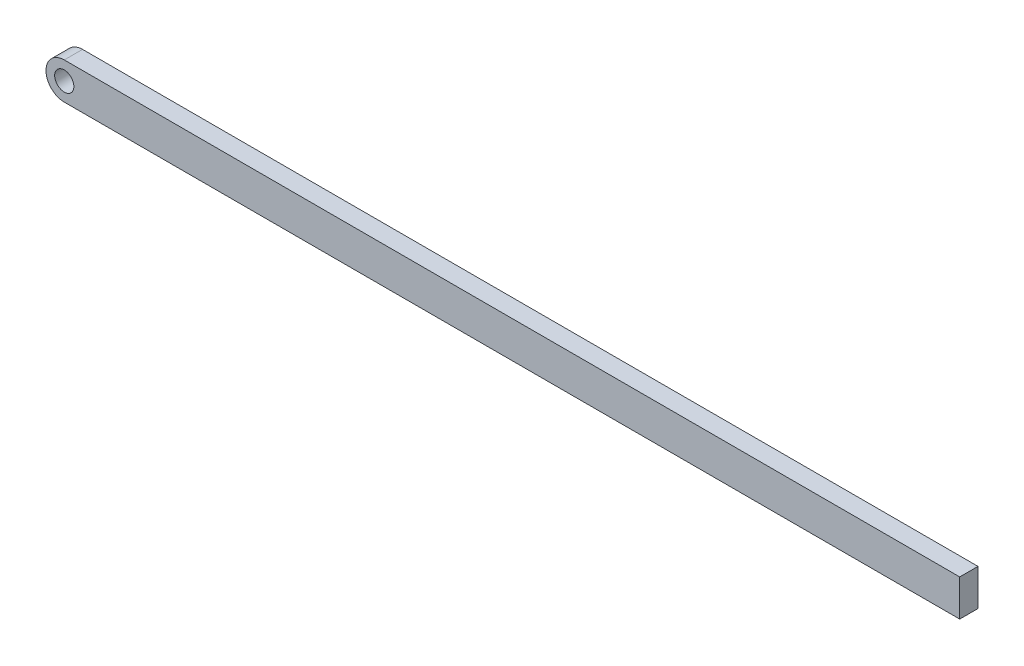
ISO-10303-21;
HEADER;
FILE_DESCRIPTION(('STEP AP214'),'2;1');
FILE_NAME('part.step','',(''),(''),'','','');
FILE_SCHEMA(('AUTOMOTIVE_DESIGN { 1 0 10303 214 1 1 1 1 }'));
ENDSEC;
DATA;
#1=APPLICATION_CONTEXT('core data for automotive mechanical design processes');
#2=APPLICATION_PROTOCOL_DEFINITION('international standard','automotive_design',2000,#1);
#3=PRODUCT_CONTEXT('',#1,'mechanical');
#4=PRODUCT('Part','Part','',(#3));
#5=PRODUCT_RELATED_PRODUCT_CATEGORY('part','',(#4));
#6=PRODUCT_DEFINITION_FORMATION('','',#4);
#7=PRODUCT_DEFINITION_CONTEXT('part definition',#1,'design');
#8=PRODUCT_DEFINITION('design','',#6,#7);
#9=PRODUCT_DEFINITION_SHAPE('','',#8);
#10=(LENGTH_UNIT() NAMED_UNIT(*) SI_UNIT(.MILLI.,.METRE.));
#11=(NAMED_UNIT(*) PLANE_ANGLE_UNIT() SI_UNIT($,.RADIAN.));
#12=(NAMED_UNIT(*) SI_UNIT($,.STERADIAN.) SOLID_ANGLE_UNIT());
#13=UNCERTAINTY_MEASURE_WITH_UNIT(LENGTH_MEASURE(1.E-05),#10,'distance_accuracy_value','');
#14=(GEOMETRIC_REPRESENTATION_CONTEXT(3) GLOBAL_UNCERTAINTY_ASSIGNED_CONTEXT((#13)) GLOBAL_UNIT_ASSIGNED_CONTEXT((#10,
#11,#12)) REPRESENTATION_CONTEXT('',''));
#15=CARTESIAN_POINT('',(0.,0.,0.));
#16=DIRECTION('',(0.,0.,1.));
#17=DIRECTION('',(1.,0.,0.));
#18=AXIS2_PLACEMENT_3D('',#15,#16,#17);
#19=CARTESIAN_POINT('',(0.,0.,-0.5));
#20=DIRECTION('',(0.,0.,1.));
#21=DIRECTION('',(1.,0.,0.));
#22=AXIS2_PLACEMENT_3D('',#19,#20,#21);
#23=PLANE('',#22);
#24=CARTESIAN_POINT('',(38.2238451762582,5.06241600523531,-0.5));
#25=DIRECTION('',(0.,0.,-1.));
#26=DIRECTION('',(-1.,0.,0.));
#27=AXIS2_PLACEMENT_3D('',#24,#25,#26);
#28=CIRCLE('',#27,1.05);
#29=CARTESIAN_POINT('',(37.1738451762582,5.06241600523531,-0.5));
#30=VERTEX_POINT('',#29);
#31=EDGE_CURVE('E138',#30,#30,#28,.T.);
#32=ORIENTED_EDGE('',*,*,#31,.T.);
#33=EDGE_LOOP('',(#32));
#34=FACE_BOUND('',#33,.T.);
#35=DIRECTION('',(-1.,0.,0.));
#36=VECTOR('',#35,1.);
#37=CARTESIAN_POINT('',(136.223845176258,3.06241600523531,-0.5));
#38=LINE('',#37,#36);
#39=CARTESIAN_POINT('',(136.223845176258,3.06241600523531,-0.5));
#40=VERTEX_POINT('',#39);
#41=CARTESIAN_POINT('',(38.2238451762582,3.06241600523531,-0.5));
#42=VERTEX_POINT('',#41);
#43=EDGE_CURVE('E11',#40,#42,#38,.T.);
#44=ORIENTED_EDGE('',*,*,#43,.F.);
#45=DIRECTION('',(0.,-1.,0.));
#46=VECTOR('',#45,1.);
#47=CARTESIAN_POINT('',(136.223845176258,7.0624160052353,-0.5));
#48=LINE('',#47,#46);
#49=CARTESIAN_POINT('',(136.223845176258,7.0624160052353,-0.5));
#50=VERTEX_POINT('',#49);
#51=EDGE_CURVE('E100',#50,#40,#48,.T.);
#52=ORIENTED_EDGE('',*,*,#51,.F.);
#53=DIRECTION('',(1.,0.,0.));
#54=VECTOR('',#53,1.);
#55=CARTESIAN_POINT('',(38.2238451762582,7.06241600523531,-0.5));
#56=LINE('',#55,#54);
#57=CARTESIAN_POINT('',(38.2238451762582,7.06241600523531,-0.5));
#58=VERTEX_POINT('',#57);
#59=EDGE_CURVE('E95',#58,#50,#56,.T.);
#60=ORIENTED_EDGE('',*,*,#59,.F.);
#61=CARTESIAN_POINT('',(38.2238451762582,5.06241600523531,-0.5));
#62=DIRECTION('',(0.,0.,-1.));
#63=DIRECTION('',(-1.,0.,0.));
#64=AXIS2_PLACEMENT_3D('',#61,#62,#63);
#65=CIRCLE('',#64,2.);
#66=EDGE_CURVE('E67',#42,#58,#65,.T.);
#67=ORIENTED_EDGE('',*,*,#66,.F.);
#68=EDGE_LOOP('',(#44,#52,#60,#67));
#69=FACE_BOUND('',#68,.T.);
#70=ADVANCED_FACE('F56',(#34,#69),#23,.T.);
#71=CARTESIAN_POINT('',(38.2238451762582,5.06241600523531,-2.5));
#72=DIRECTION('',(0.,0.,1.));
#73=DIRECTION('',(1.,0.,0.));
#74=AXIS2_PLACEMENT_3D('',#71,#72,#73);
#75=CYLINDRICAL_SURFACE('',#74,2.);
#76=ORIENTED_EDGE('',*,*,#66,.T.);
#77=DIRECTION('',(0.,0.,1.));
#78=VECTOR('',#77,1.);
#79=CARTESIAN_POINT('',(38.2238451762582,7.06241600523531,-2.5));
#80=LINE('',#79,#78);
#81=CARTESIAN_POINT('',(38.2238451762582,7.06241600523531,-2.5));
#82=VERTEX_POINT('',#81);
#83=EDGE_CURVE('E60',#82,#58,#80,.T.);
#84=ORIENTED_EDGE('',*,*,#83,.F.);
#85=CARTESIAN_POINT('',(38.2238451762582,5.06241600523531,-2.5));
#86=DIRECTION('',(0.,0.,-1.));
#87=DIRECTION('',(-1.,0.,0.));
#88=AXIS2_PLACEMENT_3D('',#85,#86,#87);
#89=CIRCLE('',#88,2.);
#90=CARTESIAN_POINT('',(38.2238451762582,3.06241600523531,-2.5));
#91=VERTEX_POINT('',#90);
#92=EDGE_CURVE('E111',#91,#82,#89,.T.);
#93=ORIENTED_EDGE('',*,*,#92,.F.);
#94=DIRECTION('',(0.,0.,1.));
#95=VECTOR('',#94,1.);
#96=CARTESIAN_POINT('',(38.2238451762582,3.06241600523531,-2.5));
#97=LINE('',#96,#95);
#98=EDGE_CURVE('E117',#91,#42,#97,.T.);
#99=ORIENTED_EDGE('',*,*,#98,.T.);
#100=EDGE_LOOP('',(#76,#84,#93,#99));
#101=FACE_BOUND('',#100,.T.);
#102=ADVANCED_FACE('F58',(#101),#75,.T.);
#103=CARTESIAN_POINT('',(136.223845176258,7.0624160052353,-2.5));
#104=DIRECTION('',(-1.,0.,0.));
#105=DIRECTION('',(0.,0.,1.));
#106=AXIS2_PLACEMENT_3D('',#103,#104,#105);
#107=PLANE('',#106);
#108=ORIENTED_EDGE('',*,*,#51,.T.);
#109=DIRECTION('',(0.,0.,1.));
#110=VECTOR('',#109,1.);
#111=CARTESIAN_POINT('',(136.223845176258,3.06241600523531,-2.5));
#112=LINE('',#111,#110);
#113=CARTESIAN_POINT('',(136.223845176258,3.06241600523531,-2.5));
#114=VERTEX_POINT('',#113);
#115=EDGE_CURVE('E107',#114,#40,#112,.T.);
#116=ORIENTED_EDGE('',*,*,#115,.F.);
#117=DIRECTION('',(0.,-1.,0.));
#118=VECTOR('',#117,1.);
#119=CARTESIAN_POINT('',(136.223845176258,7.0624160052353,-2.5));
#120=LINE('',#119,#118);
#121=CARTESIAN_POINT('',(136.223845176258,7.0624160052353,-2.5));
#122=VERTEX_POINT('',#121);
#123=EDGE_CURVE('E129',#122,#114,#120,.T.);
#124=ORIENTED_EDGE('',*,*,#123,.F.);
#125=DIRECTION('',(0.,0.,1.));
#126=VECTOR('',#125,1.);
#127=CARTESIAN_POINT('',(136.223845176258,7.0624160052353,-2.5));
#128=LINE('',#127,#126);
#129=EDGE_CURVE('E109',#122,#50,#128,.T.);
#130=ORIENTED_EDGE('',*,*,#129,.T.);
#131=EDGE_LOOP('',(#108,#116,#124,#130));
#132=FACE_BOUND('',#131,.T.);
#133=ADVANCED_FACE('F105',(#132),#107,.F.);
#134=CARTESIAN_POINT('',(38.2238451762582,5.06241600523531,-2.5));
#135=DIRECTION('',(0.,0.,-1.));
#136=DIRECTION('',(-1.,0.,0.));
#137=AXIS2_PLACEMENT_3D('',#134,#135,#136);
#138=PLANE('',#137);
#139=ORIENTED_EDGE('',*,*,#92,.T.);
#140=DIRECTION('',(1.,0.,0.));
#141=VECTOR('',#140,1.);
#142=CARTESIAN_POINT('',(38.2238451762582,7.06241600523531,-2.5));
#143=LINE('',#142,#141);
#144=EDGE_CURVE('E132',#82,#122,#143,.T.);
#145=ORIENTED_EDGE('',*,*,#144,.T.);
#146=ORIENTED_EDGE('',*,*,#123,.T.);
#147=DIRECTION('',(-1.,0.,0.));
#148=VECTOR('',#147,1.);
#149=CARTESIAN_POINT('',(136.223845176258,3.06241600523531,-2.5));
#150=LINE('',#149,#148);
#151=EDGE_CURVE('E115',#114,#91,#150,.T.);
#152=ORIENTED_EDGE('',*,*,#151,.T.);
#153=EDGE_LOOP('',(#139,#145,#146,#152));
#154=FACE_BOUND('',#153,.T.);
#155=CARTESIAN_POINT('',(38.2238451762582,5.06241600523531,-2.5));
#156=DIRECTION('',(0.,0.,-1.));
#157=DIRECTION('',(-1.,0.,0.));
#158=AXIS2_PLACEMENT_3D('',#155,#156,#157);
#159=CIRCLE('',#158,1.05);
#160=CARTESIAN_POINT('',(37.1738451762582,5.06241600523531,-2.5));
#161=VERTEX_POINT('',#160);
#162=EDGE_CURVE('E112',#161,#161,#159,.T.);
#163=ORIENTED_EDGE('',*,*,#162,.F.);
#164=EDGE_LOOP('',(#163));
#165=FACE_BOUND('',#164,.T.);
#166=ADVANCED_FACE('F149',(#154,#165),#138,.T.);
#167=CARTESIAN_POINT('',(38.2238451762582,5.06241600523531,-2.5));
#168=DIRECTION('',(0.,0.,1.));
#169=DIRECTION('',(1.,0.,0.));
#170=AXIS2_PLACEMENT_3D('',#167,#168,#169);
#171=CYLINDRICAL_SURFACE('',#170,1.05);
#172=ORIENTED_EDGE('',*,*,#162,.T.);
#173=EDGE_LOOP('',(#172));
#174=FACE_BOUND('',#173,.T.);
#175=ORIENTED_EDGE('',*,*,#31,.F.);
#176=EDGE_LOOP('',(#175));
#177=FACE_BOUND('',#176,.T.);
#178=ADVANCED_FACE('F146',(#174,#177),#171,.F.);
#179=CARTESIAN_POINT('',(38.2238451762582,7.06241600523531,-2.5));
#180=DIRECTION('',(0.,-1.,0.));
#181=DIRECTION('',(1.,0.,0.));
#182=AXIS2_PLACEMENT_3D('',#179,#180,#181);
#183=PLANE('',#182);
#184=ORIENTED_EDGE('',*,*,#83,.T.);
#185=ORIENTED_EDGE('',*,*,#59,.T.);
#186=ORIENTED_EDGE('',*,*,#129,.F.);
#187=ORIENTED_EDGE('',*,*,#144,.F.);
#188=EDGE_LOOP('',(#184,#185,#186,#187));
#189=FACE_BOUND('',#188,.T.);
#190=ADVANCED_FACE('F157',(#189),#183,.F.);
#191=CARTESIAN_POINT('',(136.223845176258,3.06241600523531,-2.5));
#192=DIRECTION('',(0.,1.,0.));
#193=DIRECTION('',(0.,0.,1.));
#194=AXIS2_PLACEMENT_3D('',#191,#192,#193);
#195=PLANE('',#194);
#196=ORIENTED_EDGE('',*,*,#115,.T.);
#197=ORIENTED_EDGE('',*,*,#43,.T.);
#198=ORIENTED_EDGE('',*,*,#98,.F.);
#199=ORIENTED_EDGE('',*,*,#151,.F.);
#200=EDGE_LOOP('',(#196,#197,#198,#199));
#201=FACE_BOUND('',#200,.T.);
#202=ADVANCED_FACE('F114',(#201),#195,.F.);
#203=CLOSED_SHELL('',(#70,#102,#133,#166,#178,#190,#202));
#204=MANIFOLD_SOLID_BREP('B2',#203);
#205=ADVANCED_BREP_SHAPE_REPRESENTATION('',(#18,#204),#14);
#206=SHAPE_DEFINITION_REPRESENTATION(#9,#205);
ENDSEC;
END-ISO-10303-21;
